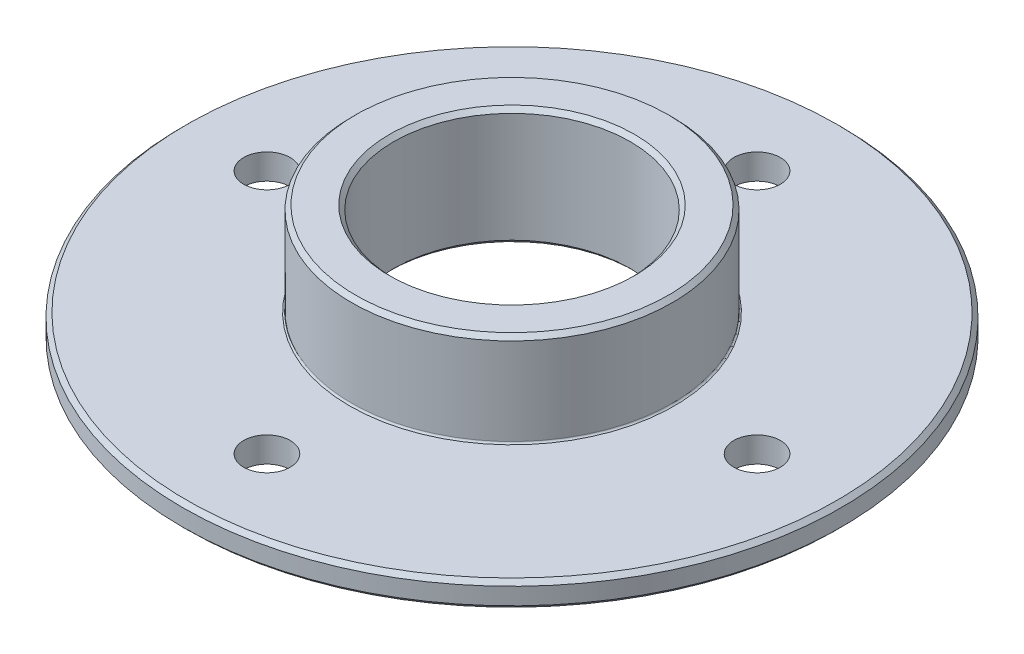
ISO-10303-21;
HEADER;
FILE_DESCRIPTION(('STEP AP214'),'2;1');
FILE_NAME('part.step','',(''),(''),'','','');
FILE_SCHEMA(('AUTOMOTIVE_DESIGN { 1 0 10303 214 1 1 1 1 }'));
ENDSEC;
DATA;
#1=APPLICATION_CONTEXT('core data for automotive mechanical design processes');
#2=APPLICATION_PROTOCOL_DEFINITION('international standard','automotive_design',2000,#1);
#3=PRODUCT_CONTEXT('',#1,'mechanical');
#4=PRODUCT('Part','Part','',(#3));
#5=PRODUCT_RELATED_PRODUCT_CATEGORY('part','',(#4));
#6=PRODUCT_DEFINITION_FORMATION('','',#4);
#7=PRODUCT_DEFINITION_CONTEXT('part definition',#1,'design');
#8=PRODUCT_DEFINITION('design','',#6,#7);
#9=PRODUCT_DEFINITION_SHAPE('','',#8);
#10=(LENGTH_UNIT() NAMED_UNIT(*) SI_UNIT(.MILLI.,.METRE.));
#11=(NAMED_UNIT(*) PLANE_ANGLE_UNIT() SI_UNIT($,.RADIAN.));
#12=(NAMED_UNIT(*) SI_UNIT($,.STERADIAN.) SOLID_ANGLE_UNIT());
#13=UNCERTAINTY_MEASURE_WITH_UNIT(LENGTH_MEASURE(1.E-05),#10,'distance_accuracy_value','');
#14=(GEOMETRIC_REPRESENTATION_CONTEXT(3) GLOBAL_UNCERTAINTY_ASSIGNED_CONTEXT((#13)) GLOBAL_UNIT_ASSIGNED_CONTEXT((#10,
#11,#12)) REPRESENTATION_CONTEXT('',''));
#15=CARTESIAN_POINT('',(0.,0.,0.));
#16=DIRECTION('',(0.,0.,1.));
#17=DIRECTION('',(1.,0.,0.));
#18=AXIS2_PLACEMENT_3D('',#15,#16,#17);
#19=CARTESIAN_POINT('',(19.,0.,0.));
#20=DIRECTION('',(0.,-1.,0.));
#21=DIRECTION('',(0.,0.,-1.));
#22=AXIS2_PLACEMENT_3D('',#19,#20,#21);
#23=PLANE('',#22);
#24=CARTESIAN_POINT('',(0.,0.,0.));
#25=DIRECTION('',(0.,-1.,0.));
#26=DIRECTION('',(0.,0.,-1.));
#27=AXIS2_PLACEMENT_3D('',#24,#25,#26);
#28=CIRCLE('',#27,38.5);
#29=CARTESIAN_POINT('',(0.,0.,-38.5));
#30=VERTEX_POINT('',#29);
#31=EDGE_CURVE('E52',#30,#30,#28,.F.);
#32=ORIENTED_EDGE('',*,*,#31,.T.);
#33=EDGE_LOOP('',(#32));
#34=FACE_BOUND('',#33,.T.);
#35=CARTESIAN_POINT('',(0.,0.,0.));
#36=DIRECTION('',(0.,-1.,0.));
#37=DIRECTION('',(0.,0.,-1.));
#38=AXIS2_PLACEMENT_3D('',#35,#36,#37);
#39=CIRCLE('',#38,19.2);
#40=CARTESIAN_POINT('',(0.,0.,-19.2));
#41=VERTEX_POINT('',#40);
#42=EDGE_CURVE('E87',#41,#41,#39,.T.);
#43=ORIENTED_EDGE('',*,*,#42,.T.);
#44=EDGE_LOOP('',(#43));
#45=FACE_BOUND('',#44,.T.);
#46=CARTESIAN_POINT('',(0.,0.,-29.));
#47=DIRECTION('',(0.,1.,0.));
#48=DIRECTION('',(0.,0.,1.));
#49=AXIS2_PLACEMENT_3D('',#46,#47,#48);
#50=CIRCLE('',#49,2.75);
#51=CARTESIAN_POINT('',(0.,0.,-26.25));
#52=VERTEX_POINT('',#51);
#53=EDGE_CURVE('E123',#52,#52,#50,.T.);
#54=ORIENTED_EDGE('',*,*,#53,.F.);
#55=EDGE_LOOP('',(#54));
#56=FACE_BOUND('',#55,.T.);
#57=CARTESIAN_POINT('',(0.,0.,29.));
#58=DIRECTION('',(0.,1.,0.));
#59=DIRECTION('',(0.,0.,1.));
#60=AXIS2_PLACEMENT_3D('',#57,#58,#59);
#61=CIRCLE('',#60,2.75);
#62=CARTESIAN_POINT('',(0.,0.,31.75));
#63=VERTEX_POINT('',#62);
#64=EDGE_CURVE('E107',#63,#63,#61,.T.);
#65=ORIENTED_EDGE('',*,*,#64,.F.);
#66=EDGE_LOOP('',(#65));
#67=FACE_BOUND('',#66,.T.);
#68=CARTESIAN_POINT('',(-29.,0.,0.));
#69=DIRECTION('',(0.,1.,0.));
#70=DIRECTION('',(0.,0.,1.));
#71=AXIS2_PLACEMENT_3D('',#68,#69,#70);
#72=CIRCLE('',#71,2.75);
#73=CARTESIAN_POINT('',(-29.,0.,2.75));
#74=VERTEX_POINT('',#73);
#75=EDGE_CURVE('E99',#74,#74,#72,.T.);
#76=ORIENTED_EDGE('',*,*,#75,.F.);
#77=EDGE_LOOP('',(#76));
#78=FACE_BOUND('',#77,.T.);
#79=CARTESIAN_POINT('',(29.,0.,0.));
#80=DIRECTION('',(0.,1.,0.));
#81=DIRECTION('',(0.,0.,1.));
#82=AXIS2_PLACEMENT_3D('',#79,#80,#81);
#83=CIRCLE('',#82,2.75);
#84=CARTESIAN_POINT('',(29.,0.,2.75));
#85=VERTEX_POINT('',#84);
#86=EDGE_CURVE('E115',#85,#85,#83,.T.);
#87=ORIENTED_EDGE('',*,*,#86,.F.);
#88=EDGE_LOOP('',(#87));
#89=FACE_BOUND('',#88,.T.);
#90=ADVANCED_FACE('F39',(#34,#45,#56,#67,#78,#89),#23,.F.);
#91=CARTESIAN_POINT('',(0.,17.9540192467724,0.));
#92=DIRECTION('',(0.,1.,0.));
#93=DIRECTION('',(0.,0.,1.));
#94=AXIS2_PLACEMENT_3D('',#91,#92,#93);
#95=CYLINDRICAL_SURFACE('',#94,14.);
#96=CARTESIAN_POINT('',(0.,10.5,0.));
#97=DIRECTION('',(0.,-1.,0.));
#98=DIRECTION('',(0.,0.,-1.));
#99=AXIS2_PLACEMENT_3D('',#96,#97,#98);
#100=CIRCLE('',#99,14.);
#101=CARTESIAN_POINT('',(0.,10.5,-14.));
#102=VERTEX_POINT('',#101);
#103=EDGE_CURVE('E10',#102,#102,#100,.F.);
#104=ORIENTED_EDGE('',*,*,#103,.T.);
#105=EDGE_LOOP('',(#104));
#106=FACE_BOUND('',#105,.T.);
#107=CARTESIAN_POINT('',(0.,-2.49999999999998,0.));
#108=DIRECTION('',(0.,1.,0.));
#109=DIRECTION('',(0.,0.,1.));
#110=AXIS2_PLACEMENT_3D('',#107,#108,#109);
#111=CIRCLE('',#110,14.);
#112=CARTESIAN_POINT('',(0.,-2.49999999999998,14.));
#113=VERTEX_POINT('',#112);
#114=EDGE_CURVE('E67',#113,#113,#111,.F.);
#115=ORIENTED_EDGE('',*,*,#114,.T.);
#116=EDGE_LOOP('',(#115));
#117=FACE_BOUND('',#116,.T.);
#118=ADVANCED_FACE('F132',(#106,#117),#95,.F.);
#119=CARTESIAN_POINT('',(39.,-3.,0.));
#120=DIRECTION('',(0.,1.,0.));
#121=DIRECTION('',(0.,0.,1.));
#122=AXIS2_PLACEMENT_3D('',#119,#120,#121);
#123=PLANE('',#122);
#124=CARTESIAN_POINT('',(0.,-3.,0.));
#125=DIRECTION('',(0.,1.,0.));
#126=DIRECTION('',(0.,0.,1.));
#127=AXIS2_PLACEMENT_3D('',#124,#125,#126);
#128=CIRCLE('',#127,14.5);
#129=CARTESIAN_POINT('',(0.,-3.,14.5));
#130=VERTEX_POINT('',#129);
#131=EDGE_CURVE('E71',#130,#130,#128,.T.);
#132=ORIENTED_EDGE('',*,*,#131,.T.);
#133=EDGE_LOOP('',(#132));
#134=FACE_BOUND('',#133,.T.);
#135=CARTESIAN_POINT('',(0.,-3.,0.));
#136=DIRECTION('',(0.,1.,0.));
#137=DIRECTION('',(0.,0.,1.));
#138=AXIS2_PLACEMENT_3D('',#135,#136,#137);
#139=CIRCLE('',#138,38.5);
#140=CARTESIAN_POINT('',(0.,-3.,38.5));
#141=VERTEX_POINT('',#140);
#142=EDGE_CURVE('E75',#141,#141,#139,.F.);
#143=ORIENTED_EDGE('',*,*,#142,.T.);
#144=EDGE_LOOP('',(#143));
#145=FACE_BOUND('',#144,.T.);
#146=CARTESIAN_POINT('',(0.,-3.,-29.));
#147=DIRECTION('',(0.,1.,0.));
#148=DIRECTION('',(0.,0.,1.));
#149=AXIS2_PLACEMENT_3D('',#146,#147,#148);
#150=CIRCLE('',#149,2.75);
#151=CARTESIAN_POINT('',(0.,-3.,-26.25));
#152=VERTEX_POINT('',#151);
#153=EDGE_CURVE('E119',#152,#152,#150,.T.);
#154=ORIENTED_EDGE('',*,*,#153,.T.);
#155=EDGE_LOOP('',(#154));
#156=FACE_BOUND('',#155,.T.);
#157=CARTESIAN_POINT('',(29.,-3.,0.));
#158=DIRECTION('',(0.,1.,0.));
#159=DIRECTION('',(0.,0.,1.));
#160=AXIS2_PLACEMENT_3D('',#157,#158,#159);
#161=CIRCLE('',#160,2.75);
#162=CARTESIAN_POINT('',(29.,-3.,2.75));
#163=VERTEX_POINT('',#162);
#164=EDGE_CURVE('E111',#163,#163,#161,.T.);
#165=ORIENTED_EDGE('',*,*,#164,.T.);
#166=EDGE_LOOP('',(#165));
#167=FACE_BOUND('',#166,.T.);
#168=CARTESIAN_POINT('',(0.,-3.,29.));
#169=DIRECTION('',(0.,1.,0.));
#170=DIRECTION('',(0.,0.,1.));
#171=AXIS2_PLACEMENT_3D('',#168,#169,#170);
#172=CIRCLE('',#171,2.75);
#173=CARTESIAN_POINT('',(0.,-3.,31.75));
#174=VERTEX_POINT('',#173);
#175=EDGE_CURVE('E103',#174,#174,#172,.T.);
#176=ORIENTED_EDGE('',*,*,#175,.T.);
#177=EDGE_LOOP('',(#176));
#178=FACE_BOUND('',#177,.T.);
#179=CARTESIAN_POINT('',(-29.,-3.,0.));
#180=DIRECTION('',(0.,1.,0.));
#181=DIRECTION('',(0.,0.,1.));
#182=AXIS2_PLACEMENT_3D('',#179,#180,#181);
#183=CIRCLE('',#182,2.75);
#184=CARTESIAN_POINT('',(-29.,-3.,2.75));
#185=VERTEX_POINT('',#184);
#186=EDGE_CURVE('E95',#185,#185,#183,.T.);
#187=ORIENTED_EDGE('',*,*,#186,.T.);
#188=EDGE_LOOP('',(#187));
#189=FACE_BOUND('',#188,.T.);
#190=ADVANCED_FACE('F171',(#134,#145,#156,#167,#178,#189),#123,.F.);
#191=CARTESIAN_POINT('',(0.,17.9540192467724,0.));
#192=DIRECTION('',(0.,1.,0.));
#193=DIRECTION('',(0.,0.,1.));
#194=AXIS2_PLACEMENT_3D('',#191,#192,#193);
#195=CYLINDRICAL_SURFACE('',#194,39.);
#196=CARTESIAN_POINT('',(0.,-2.5,0.));
#197=DIRECTION('',(0.,1.,0.));
#198=DIRECTION('',(0.,0.,1.));
#199=AXIS2_PLACEMENT_3D('',#196,#197,#198);
#200=CIRCLE('',#199,39.);
#201=CARTESIAN_POINT('',(0.,-2.5,39.));
#202=VERTEX_POINT('',#201);
#203=EDGE_CURVE('E57',#202,#202,#200,.T.);
#204=ORIENTED_EDGE('',*,*,#203,.T.);
#205=EDGE_LOOP('',(#204));
#206=FACE_BOUND('',#205,.T.);
#207=CARTESIAN_POINT('',(0.,-0.5,0.));
#208=DIRECTION('',(0.,-1.,0.));
#209=DIRECTION('',(0.,0.,-1.));
#210=AXIS2_PLACEMENT_3D('',#207,#208,#209);
#211=CIRCLE('',#210,39.);
#212=CARTESIAN_POINT('',(0.,-0.5,-39.));
#213=VERTEX_POINT('',#212);
#214=EDGE_CURVE('E63',#213,#213,#211,.T.);
#215=ORIENTED_EDGE('',*,*,#214,.T.);
#216=EDGE_LOOP('',(#215));
#217=FACE_BOUND('',#216,.T.);
#218=ADVANCED_FACE('F166',(#206,#217),#195,.T.);
#219=CARTESIAN_POINT('',(0.,17.9540192467724,0.));
#220=DIRECTION('',(0.,1.,0.));
#221=DIRECTION('',(0.,0.,1.));
#222=AXIS2_PLACEMENT_3D('',#219,#220,#221);
#223=CYLINDRICAL_SURFACE('',#222,19.);
#224=CARTESIAN_POINT('',(0.,10.5,0.));
#225=DIRECTION('',(0.,-1.,0.));
#226=DIRECTION('',(0.,0.,-1.));
#227=AXIS2_PLACEMENT_3D('',#224,#225,#226);
#228=CIRCLE('',#227,19.);
#229=CARTESIAN_POINT('',(0.,10.5,-19.));
#230=VERTEX_POINT('',#229);
#231=EDGE_CURVE('E79',#230,#230,#228,.T.);
#232=ORIENTED_EDGE('',*,*,#231,.T.);
#233=EDGE_LOOP('',(#232));
#234=FACE_BOUND('',#233,.T.);
#235=CARTESIAN_POINT('',(0.,0.199999999999999,0.));
#236=DIRECTION('',(0.,-1.,0.));
#237=DIRECTION('',(0.,0.,-1.));
#238=AXIS2_PLACEMENT_3D('',#235,#236,#237);
#239=CIRCLE('',#238,19.);
#240=CARTESIAN_POINT('',(0.,0.199999999999999,-19.));
#241=VERTEX_POINT('',#240);
#242=EDGE_CURVE('E91',#241,#241,#239,.F.);
#243=ORIENTED_EDGE('',*,*,#242,.T.);
#244=EDGE_LOOP('',(#243));
#245=FACE_BOUND('',#244,.T.);
#246=ADVANCED_FACE('F164',(#234,#245),#223,.T.);
#247=CARTESIAN_POINT('',(19.,11.,0.));
#248=DIRECTION('',(0.,-1.,0.));
#249=DIRECTION('',(0.,0.,-1.));
#250=AXIS2_PLACEMENT_3D('',#247,#248,#249);
#251=PLANE('',#250);
#252=CARTESIAN_POINT('',(0.,11.,0.));
#253=DIRECTION('',(0.,-1.,0.));
#254=DIRECTION('',(0.,0.,-1.));
#255=AXIS2_PLACEMENT_3D('',#252,#253,#254);
#256=CIRCLE('',#255,14.5);
#257=CARTESIAN_POINT('',(0.,11.,-14.5));
#258=VERTEX_POINT('',#257);
#259=EDGE_CURVE('E47',#258,#258,#256,.T.);
#260=ORIENTED_EDGE('',*,*,#259,.T.);
#261=EDGE_LOOP('',(#260));
#262=FACE_BOUND('',#261,.T.);
#263=CARTESIAN_POINT('',(0.,11.,0.));
#264=DIRECTION('',(0.,-1.,0.));
#265=DIRECTION('',(0.,0.,-1.));
#266=AXIS2_PLACEMENT_3D('',#263,#264,#265);
#267=CIRCLE('',#266,18.5);
#268=CARTESIAN_POINT('',(0.,11.,-18.5));
#269=VERTEX_POINT('',#268);
#270=EDGE_CURVE('E83',#269,#269,#267,.F.);
#271=ORIENTED_EDGE('',*,*,#270,.T.);
#272=EDGE_LOOP('',(#271));
#273=FACE_BOUND('',#272,.T.);
#274=ADVANCED_FACE('F160',(#262,#273),#251,.F.);
#275=CARTESIAN_POINT('',(-29.,0.,0.));
#276=DIRECTION('',(0.,1.,0.));
#277=DIRECTION('',(0.,0.,1.));
#278=AXIS2_PLACEMENT_3D('',#275,#276,#277);
#279=CYLINDRICAL_SURFACE('',#278,2.75);
#280=ORIENTED_EDGE('',*,*,#186,.F.);
#281=EDGE_LOOP('',(#280));
#282=FACE_BOUND('',#281,.T.);
#283=ORIENTED_EDGE('',*,*,#75,.T.);
#284=EDGE_LOOP('',(#283));
#285=FACE_BOUND('',#284,.T.);
#286=ADVANCED_FACE('F153',(#282,#285),#279,.F.);
#287=CARTESIAN_POINT('',(0.,0.,29.));
#288=DIRECTION('',(0.,1.,0.));
#289=DIRECTION('',(0.,0.,1.));
#290=AXIS2_PLACEMENT_3D('',#287,#288,#289);
#291=CYLINDRICAL_SURFACE('',#290,2.75);
#292=ORIENTED_EDGE('',*,*,#175,.F.);
#293=EDGE_LOOP('',(#292));
#294=FACE_BOUND('',#293,.T.);
#295=ORIENTED_EDGE('',*,*,#64,.T.);
#296=EDGE_LOOP('',(#295));
#297=FACE_BOUND('',#296,.T.);
#298=ADVANCED_FACE('F143',(#294,#297),#291,.F.);
#299=CARTESIAN_POINT('',(29.,0.,0.));
#300=DIRECTION('',(0.,1.,0.));
#301=DIRECTION('',(0.,0.,1.));
#302=AXIS2_PLACEMENT_3D('',#299,#300,#301);
#303=CYLINDRICAL_SURFACE('',#302,2.75);
#304=ORIENTED_EDGE('',*,*,#164,.F.);
#305=EDGE_LOOP('',(#304));
#306=FACE_BOUND('',#305,.T.);
#307=ORIENTED_EDGE('',*,*,#86,.T.);
#308=EDGE_LOOP('',(#307));
#309=FACE_BOUND('',#308,.T.);
#310=ADVANCED_FACE('F141',(#306,#309),#303,.F.);
#311=CARTESIAN_POINT('',(0.,0.,-29.));
#312=DIRECTION('',(0.,1.,0.));
#313=DIRECTION('',(0.,0.,1.));
#314=AXIS2_PLACEMENT_3D('',#311,#312,#313);
#315=CYLINDRICAL_SURFACE('',#314,2.75);
#316=ORIENTED_EDGE('',*,*,#153,.F.);
#317=EDGE_LOOP('',(#316));
#318=FACE_BOUND('',#317,.T.);
#319=ORIENTED_EDGE('',*,*,#53,.T.);
#320=EDGE_LOOP('',(#319));
#321=FACE_BOUND('',#320,.T.);
#322=ADVANCED_FACE('F128',(#318,#321),#315,.F.);
#323=CARTESIAN_POINT('',(0.,0.199999999999999,0.));
#324=DIRECTION('',(0.,-1.,0.));
#325=DIRECTION('',(0.,0.,-1.));
#326=AXIS2_PLACEMENT_3D('',#323,#324,#325);
#327=TOROIDAL_SURFACE('',#326,19.2,0.2);
#328=ORIENTED_EDGE('',*,*,#42,.F.);
#329=EDGE_LOOP('',(#328));
#330=FACE_BOUND('',#329,.T.);
#331=ORIENTED_EDGE('',*,*,#242,.F.);
#332=EDGE_LOOP('',(#331));
#333=FACE_BOUND('',#332,.T.);
#334=ADVANCED_FACE('F150',(#330,#333),#327,.F.);
#335=CARTESIAN_POINT('',(0.,11.,0.));
#336=DIRECTION('',(0.,-1.,0.));
#337=DIRECTION('',(0.,0.,-1.));
#338=AXIS2_PLACEMENT_3D('',#335,#336,#337);
#339=CONICAL_SURFACE('',#338,18.5,0.785398163397445);
#340=ORIENTED_EDGE('',*,*,#231,.F.);
#341=EDGE_LOOP('',(#340));
#342=FACE_BOUND('',#341,.T.);
#343=ORIENTED_EDGE('',*,*,#270,.F.);
#344=EDGE_LOOP('',(#343));
#345=FACE_BOUND('',#344,.T.);
#346=ADVANCED_FACE('F180',(#342,#345),#339,.T.);
#347=CARTESIAN_POINT('',(0.,-3.,0.));
#348=DIRECTION('',(0.,-1.,0.));
#349=DIRECTION('',(0.,0.,-1.));
#350=AXIS2_PLACEMENT_3D('',#347,#348,#349);
#351=CONICAL_SURFACE('',#350,14.5,0.78539816339744);
#352=ORIENTED_EDGE('',*,*,#114,.F.);
#353=EDGE_LOOP('',(#352));
#354=FACE_BOUND('',#353,.T.);
#355=ORIENTED_EDGE('',*,*,#131,.F.);
#356=EDGE_LOOP('',(#355));
#357=FACE_BOUND('',#356,.T.);
#358=ADVANCED_FACE('F184',(#354,#357),#351,.F.);
#359=CARTESIAN_POINT('',(0.,-2.5,0.));
#360=DIRECTION('',(0.,1.,0.));
#361=DIRECTION('',(0.,0.,1.));
#362=AXIS2_PLACEMENT_3D('',#359,#360,#361);
#363=CONICAL_SURFACE('',#362,39.,0.785398163397448);
#364=ORIENTED_EDGE('',*,*,#142,.F.);
#365=EDGE_LOOP('',(#364));
#366=FACE_BOUND('',#365,.T.);
#367=ORIENTED_EDGE('',*,*,#203,.F.);
#368=EDGE_LOOP('',(#367));
#369=FACE_BOUND('',#368,.T.);
#370=ADVANCED_FACE('F188',(#366,#369),#363,.T.);
#371=CARTESIAN_POINT('',(0.,0.,0.));
#372=DIRECTION('',(0.,-1.,0.));
#373=DIRECTION('',(0.,0.,-1.));
#374=AXIS2_PLACEMENT_3D('',#371,#372,#373);
#375=CONICAL_SURFACE('',#374,38.5,0.785398163397462);
#376=ORIENTED_EDGE('',*,*,#214,.F.);
#377=EDGE_LOOP('',(#376));
#378=FACE_BOUND('',#377,.T.);
#379=ORIENTED_EDGE('',*,*,#31,.F.);
#380=EDGE_LOOP('',(#379));
#381=FACE_BOUND('',#380,.T.);
#382=ADVANCED_FACE('F191',(#378,#381),#375,.T.);
#383=CARTESIAN_POINT('',(0.,11.,0.));
#384=DIRECTION('',(0.,1.,0.));
#385=DIRECTION('',(0.,0.,1.));
#386=AXIS2_PLACEMENT_3D('',#383,#384,#385);
#387=CONICAL_SURFACE('',#386,14.5,0.785398163397441);
#388=ORIENTED_EDGE('',*,*,#103,.F.);
#389=EDGE_LOOP('',(#388));
#390=FACE_BOUND('',#389,.T.);
#391=ORIENTED_EDGE('',*,*,#259,.F.);
#392=EDGE_LOOP('',(#391));
#393=FACE_BOUND('',#392,.T.);
#394=ADVANCED_FACE('F41',(#390,#393),#387,.F.);
#395=CLOSED_SHELL('',(#90,#118,#190,#218,#246,#274,#286,#298,#310,#322,#334,#346,#358,#370,#382,#394));
#396=MANIFOLD_SOLID_BREP('B2',#395);
#397=ADVANCED_BREP_SHAPE_REPRESENTATION('',(#18,#396),#14);
#398=SHAPE_DEFINITION_REPRESENTATION(#9,#397);
ENDSEC;
END-ISO-10303-21;
